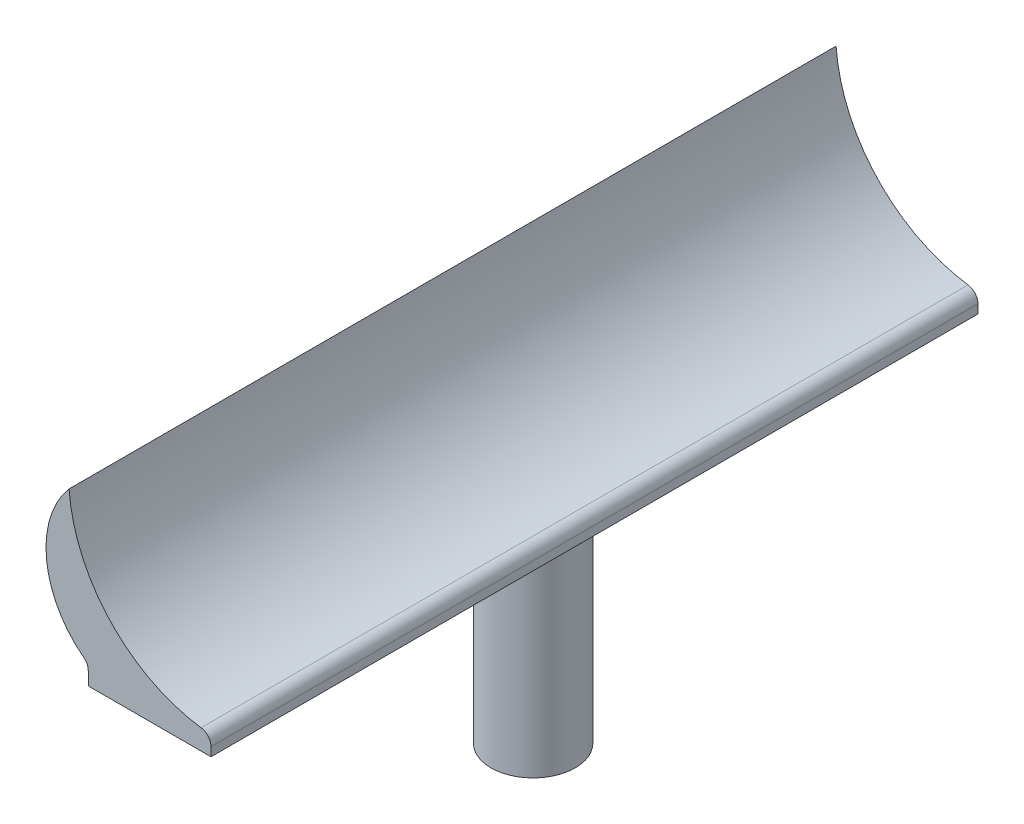
ISO-10303-21;
HEADER;
FILE_DESCRIPTION(('STEP AP214'),'2;1');
FILE_NAME('part.step','',(''),(''),'','','');
FILE_SCHEMA(('AUTOMOTIVE_DESIGN { 1 0 10303 214 1 1 1 1 }'));
ENDSEC;
DATA;
#1=APPLICATION_CONTEXT('core data for automotive mechanical design processes');
#2=APPLICATION_PROTOCOL_DEFINITION('international standard','automotive_design',2000,#1);
#3=PRODUCT_CONTEXT('',#1,'mechanical');
#4=PRODUCT('Part','Part','',(#3));
#5=PRODUCT_RELATED_PRODUCT_CATEGORY('part','',(#4));
#6=PRODUCT_DEFINITION_FORMATION('','',#4);
#7=PRODUCT_DEFINITION_CONTEXT('part definition',#1,'design');
#8=PRODUCT_DEFINITION('design','',#6,#7);
#9=PRODUCT_DEFINITION_SHAPE('','',#8);
#10=(LENGTH_UNIT() NAMED_UNIT(*) SI_UNIT(.MILLI.,.METRE.));
#11=(NAMED_UNIT(*) PLANE_ANGLE_UNIT() SI_UNIT($,.RADIAN.));
#12=(NAMED_UNIT(*) SI_UNIT($,.STERADIAN.) SOLID_ANGLE_UNIT());
#13=UNCERTAINTY_MEASURE_WITH_UNIT(LENGTH_MEASURE(1.E-05),#10,'distance_accuracy_value','');
#14=(GEOMETRIC_REPRESENTATION_CONTEXT(3) GLOBAL_UNCERTAINTY_ASSIGNED_CONTEXT((#13)) GLOBAL_UNIT_ASSIGNED_CONTEXT((#10,
#11,#12)) REPRESENTATION_CONTEXT('',''));
#15=CARTESIAN_POINT('',(0.,0.,0.));
#16=DIRECTION('',(0.,0.,1.));
#17=DIRECTION('',(1.,0.,0.));
#18=AXIS2_PLACEMENT_3D('',#15,#16,#17);
#19=CARTESIAN_POINT('',(0.,55.,0.));
#20=DIRECTION('',(0.,-1.,0.));
#21=DIRECTION('',(0.,0.,-1.));
#22=AXIS2_PLACEMENT_3D('',#19,#20,#21);
#23=CYLINDRICAL_SURFACE('',#22,11.);
#24=CARTESIAN_POINT('',(0.,55.,0.));
#25=DIRECTION('',(0.,1.,0.));
#26=DIRECTION('',(0.,0.,1.));
#27=AXIS2_PLACEMENT_3D('',#24,#25,#26);
#28=CIRCLE('',#27,11.);
#29=CARTESIAN_POINT('',(0.,55.,11.));
#30=VERTEX_POINT('',#29);
#31=EDGE_CURVE('E127',#30,#30,#28,.T.);
#32=ORIENTED_EDGE('',*,*,#31,.F.);
#33=EDGE_LOOP('',(#32));
#34=FACE_BOUND('',#33,.T.);
#35=CARTESIAN_POINT('',(0.,0.,0.));
#36=DIRECTION('',(0.,1.,0.));
#37=DIRECTION('',(0.,0.,1.));
#38=AXIS2_PLACEMENT_3D('',#35,#36,#37);
#39=CIRCLE('',#38,11.);
#40=CARTESIAN_POINT('',(0.,0.,11.));
#41=VERTEX_POINT('',#40);
#42=EDGE_CURVE('E125',#41,#41,#39,.T.);
#43=ORIENTED_EDGE('',*,*,#42,.T.);
#44=EDGE_LOOP('',(#43));
#45=FACE_BOUND('',#44,.T.);
#46=ADVANCED_FACE('F39',(#34,#45),#23,.T.);
#47=CARTESIAN_POINT('',(0.,0.,0.));
#48=DIRECTION('',(0.,1.,0.));
#49=DIRECTION('',(0.,0.,1.));
#50=AXIS2_PLACEMENT_3D('',#47,#48,#49);
#51=PLANE('',#50);
#52=ORIENTED_EDGE('',*,*,#42,.F.);
#53=EDGE_LOOP('',(#52));
#54=FACE_BOUND('',#53,.T.);
#55=ADVANCED_FACE('F167',(#54),#51,.F.);
#56=CARTESIAN_POINT('',(-16.,55.,100.));
#57=DIRECTION('',(1.,0.,0.));
#58=DIRECTION('',(0.,0.,-1.));
#59=AXIS2_PLACEMENT_3D('',#56,#57,#58);
#60=PLANE('',#59);
#61=DIRECTION('',(0.,-1.,0.));
#62=VECTOR('',#61,1.);
#63=CARTESIAN_POINT('',(-16.,55.,100.));
#64=LINE('',#63,#62);
#65=CARTESIAN_POINT('',(-16.,58.4618250900017,100.));
#66=VERTEX_POINT('',#65);
#67=CARTESIAN_POINT('',(-16.,55.,100.));
#68=VERTEX_POINT('',#67);
#69=EDGE_CURVE('E98',#66,#68,#64,.T.);
#70=ORIENTED_EDGE('',*,*,#69,.F.);
#71=DIRECTION('',(0.,0.,1.));
#72=VECTOR('',#71,1.);
#73=CARTESIAN_POINT('',(-16.,58.4618250900017,-100.));
#74=LINE('',#73,#72);
#75=CARTESIAN_POINT('',(-16.,58.4618250900017,-100.));
#76=VERTEX_POINT('',#75);
#77=EDGE_CURVE('E134',#66,#76,#74,.F.);
#78=ORIENTED_EDGE('',*,*,#77,.T.);
#79=DIRECTION('',(0.,-1.,0.));
#80=VECTOR('',#79,1.);
#81=CARTESIAN_POINT('',(-16.,55.,-100.));
#82=LINE('',#81,#80);
#83=CARTESIAN_POINT('',(-16.,55.,-100.));
#84=VERTEX_POINT('',#83);
#85=EDGE_CURVE('E124',#76,#84,#82,.T.);
#86=ORIENTED_EDGE('',*,*,#85,.T.);
#87=DIRECTION('',(0.,0.,-1.));
#88=VECTOR('',#87,1.);
#89=CARTESIAN_POINT('',(-16.,55.,100.));
#90=LINE('',#89,#88);
#91=EDGE_CURVE('E111',#68,#84,#90,.T.);
#92=ORIENTED_EDGE('',*,*,#91,.F.);
#93=EDGE_LOOP('',(#70,#78,#86,#92));
#94=FACE_BOUND('',#93,.T.);
#95=ADVANCED_FACE('F116',(#94),#60,.F.);
#96=CARTESIAN_POINT('',(-16.,55.,100.));
#97=DIRECTION('',(0.,1.,0.));
#98=DIRECTION('',(0.,0.,1.));
#99=AXIS2_PLACEMENT_3D('',#96,#97,#98);
#100=PLANE('',#99);
#101=ORIENTED_EDGE('',*,*,#31,.T.);
#102=EDGE_LOOP('',(#101));
#103=FACE_BOUND('',#102,.T.);
#104=DIRECTION('',(1.,0.,0.));
#105=VECTOR('',#104,1.);
#106=CARTESIAN_POINT('',(-16.,55.,-100.));
#107=LINE('',#106,#105);
#108=CARTESIAN_POINT('',(16.,55.,-100.));
#109=VERTEX_POINT('',#108);
#110=EDGE_CURVE('E263',#84,#109,#107,.T.);
#111=ORIENTED_EDGE('',*,*,#110,.T.);
#112=DIRECTION('',(0.,0.,-1.));
#113=VECTOR('',#112,1.);
#114=CARTESIAN_POINT('',(16.,55.,100.));
#115=LINE('',#114,#113);
#116=CARTESIAN_POINT('',(16.,55.,100.));
#117=VERTEX_POINT('',#116);
#118=EDGE_CURVE('E117',#117,#109,#115,.T.);
#119=ORIENTED_EDGE('',*,*,#118,.F.);
#120=DIRECTION('',(1.,0.,0.));
#121=VECTOR('',#120,1.);
#122=CARTESIAN_POINT('',(-16.,55.,100.));
#123=LINE('',#122,#121);
#124=EDGE_CURVE('E101',#68,#117,#123,.T.);
#125=ORIENTED_EDGE('',*,*,#124,.F.);
#126=ORIENTED_EDGE('',*,*,#91,.T.);
#127=EDGE_LOOP('',(#111,#119,#125,#126));
#128=FACE_BOUND('',#127,.T.);
#129=ADVANCED_FACE('F114',(#103,#128),#100,.F.);
#130=CARTESIAN_POINT('',(16.,55.,100.));
#131=DIRECTION('',(-1.,0.,0.));
#132=DIRECTION('',(0.,0.,1.));
#133=AXIS2_PLACEMENT_3D('',#130,#131,#132);
#134=PLANE('',#133);
#135=DIRECTION('',(0.,1.,0.));
#136=VECTOR('',#135,1.);
#137=CARTESIAN_POINT('',(16.,55.,-100.));
#138=LINE('',#137,#136);
#139=CARTESIAN_POINT('',(16.,57.3011041204456,-100.));
#140=VERTEX_POINT('',#139);
#141=EDGE_CURVE('E264',#109,#140,#138,.T.);
#142=ORIENTED_EDGE('',*,*,#141,.T.);
#143=DIRECTION('',(0.,0.,-1.));
#144=VECTOR('',#143,1.);
#145=CARTESIAN_POINT('',(16.,57.3011041204456,100.));
#146=LINE('',#145,#144);
#147=CARTESIAN_POINT('',(16.,57.3011041204456,100.));
#148=VERTEX_POINT('',#147);
#149=EDGE_CURVE('E53',#140,#148,#146,.F.);
#150=ORIENTED_EDGE('',*,*,#149,.T.);
#151=DIRECTION('',(0.,1.,0.));
#152=VECTOR('',#151,1.);
#153=CARTESIAN_POINT('',(16.,55.,100.));
#154=LINE('',#153,#152);
#155=EDGE_CURVE('E120',#117,#148,#154,.T.);
#156=ORIENTED_EDGE('',*,*,#155,.F.);
#157=ORIENTED_EDGE('',*,*,#118,.T.);
#158=EDGE_LOOP('',(#142,#150,#156,#157));
#159=FACE_BOUND('',#158,.T.);
#160=ADVANCED_FACE('F177',(#159),#134,.F.);
#161=CARTESIAN_POINT('',(18.8950928953347,99.8950928953347,100.));
#162=DIRECTION('',(0.,0.,-1.));
#163=DIRECTION('',(-1.,0.,0.));
#164=AXIS2_PLACEMENT_3D('',#161,#162,#163);
#165=CYLINDRICAL_SURFACE('',#164,40.);
#166=CARTESIAN_POINT('',(18.8950928953347,99.8950928953347,100.));
#167=DIRECTION('',(0.,0.,-1.));
#168=DIRECTION('',(1.,0.,0.));
#169=AXIS2_PLACEMENT_3D('',#166,#167,#168);
#170=CIRCLE('',#169,40.);
#171=CARTESIAN_POINT('',(13.4112855508373,60.272777755903,100.));
#172=VERTEX_POINT('',#171);
#173=CARTESIAN_POINT('',(-21.,97.,100.));
#174=VERTEX_POINT('',#173);
#175=EDGE_CURVE('E255',#172,#174,#170,.T.);
#176=ORIENTED_EDGE('',*,*,#175,.F.);
#177=DIRECTION('',(0.,0.,-1.));
#178=VECTOR('',#177,1.);
#179=CARTESIAN_POINT('',(13.4112855508373,60.272777755903,100.));
#180=LINE('',#179,#178);
#181=CARTESIAN_POINT('',(13.4112855508373,60.272777755903,-100.));
#182=VERTEX_POINT('',#181);
#183=EDGE_CURVE('E140',#172,#182,#180,.T.);
#184=ORIENTED_EDGE('',*,*,#183,.T.);
#185=CARTESIAN_POINT('',(18.8950928953347,99.8950928953347,-100.));
#186=DIRECTION('',(0.,0.,-1.));
#187=DIRECTION('',(1.,0.,0.));
#188=AXIS2_PLACEMENT_3D('',#185,#186,#187);
#189=CIRCLE('',#188,40.);
#190=CARTESIAN_POINT('',(-21.,97.,-100.));
#191=VERTEX_POINT('',#190);
#192=EDGE_CURVE('E152',#182,#191,#189,.T.);
#193=ORIENTED_EDGE('',*,*,#192,.T.);
#194=DIRECTION('',(0.,0.,-1.));
#195=VECTOR('',#194,1.);
#196=CARTESIAN_POINT('',(-21.,97.,100.));
#197=LINE('',#196,#195);
#198=EDGE_CURVE('E126',#174,#191,#197,.T.);
#199=ORIENTED_EDGE('',*,*,#198,.F.);
#200=EDGE_LOOP('',(#176,#184,#193,#199));
#201=FACE_BOUND('',#200,.T.);
#202=ADVANCED_FACE('F184',(#201),#165,.F.);
#203=CARTESIAN_POINT('',(-2.02149132334484,80.7268254968453,100.));
#204=DIRECTION('',(0.,0.,-1.));
#205=DIRECTION('',(-1.,0.,0.));
#206=AXIS2_PLACEMENT_3D('',#203,#204,#205);
#207=CYLINDRICAL_SURFACE('',#206,25.);
#208=CARTESIAN_POINT('',(-2.02149132334484,80.7268254968453,-100.));
#209=DIRECTION('',(0.,0.,1.));
#210=DIRECTION('',(-1.,0.,0.));
#211=AXIS2_PLACEMENT_3D('',#208,#209,#210);
#212=CIRCLE('',#211,25.);
#213=CARTESIAN_POINT('',(-17.1808740703584,60.8473608478778,-100.));
#214=VERTEX_POINT('',#213);
#215=EDGE_CURVE('E108',#191,#214,#212,.T.);
#216=ORIENTED_EDGE('',*,*,#215,.T.);
#217=DIRECTION('',(0.,0.,-1.));
#218=VECTOR('',#217,1.);
#219=CARTESIAN_POINT('',(-17.1808740703584,60.8473608478778,100.));
#220=LINE('',#219,#218);
#221=CARTESIAN_POINT('',(-17.1808740703584,60.8473608478778,100.));
#222=VERTEX_POINT('',#221);
#223=EDGE_CURVE('E139',#214,#222,#220,.F.);
#224=ORIENTED_EDGE('',*,*,#223,.T.);
#225=CARTESIAN_POINT('',(-2.02149132334484,80.7268254968453,100.));
#226=DIRECTION('',(0.,0.,1.));
#227=DIRECTION('',(-1.,0.,0.));
#228=AXIS2_PLACEMENT_3D('',#225,#226,#227);
#229=CIRCLE('',#228,25.);
#230=EDGE_CURVE('E258',#174,#222,#229,.T.);
#231=ORIENTED_EDGE('',*,*,#230,.F.);
#232=ORIENTED_EDGE('',*,*,#198,.T.);
#233=EDGE_LOOP('',(#216,#224,#231,#232));
#234=FACE_BOUND('',#233,.T.);
#235=ADVANCED_FACE('F151',(#234),#207,.T.);
#236=CARTESIAN_POINT('',(-2.02149132334484,80.7268254968453,100.));
#237=DIRECTION('',(0.,0.,-1.));
#238=DIRECTION('',(-1.,0.,0.));
#239=AXIS2_PLACEMENT_3D('',#236,#237,#238);
#240=PLANE('',#239);
#241=ORIENTED_EDGE('',*,*,#155,.T.);
#242=CARTESIAN_POINT('',(13.,57.3011041204456,100.));
#243=DIRECTION('',(0.,0.,-1.));
#244=DIRECTION('',(-1.,0.,0.));
#245=AXIS2_PLACEMENT_3D('',#242,#243,#244);
#246=CIRCLE('',#245,3.);
#247=EDGE_CURVE('E141',#148,#172,#246,.F.);
#248=ORIENTED_EDGE('',*,*,#247,.T.);
#249=ORIENTED_EDGE('',*,*,#175,.T.);
#250=ORIENTED_EDGE('',*,*,#230,.T.);
#251=CARTESIAN_POINT('',(-19.,58.4618250900017,100.));
#252=DIRECTION('',(0.,0.,-1.));
#253=DIRECTION('',(-1.,0.,0.));
#254=AXIS2_PLACEMENT_3D('',#251,#252,#253);
#255=CIRCLE('',#254,3.);
#256=EDGE_CURVE('E11',#222,#66,#255,.T.);
#257=ORIENTED_EDGE('',*,*,#256,.T.);
#258=ORIENTED_EDGE('',*,*,#69,.T.);
#259=ORIENTED_EDGE('',*,*,#124,.T.);
#260=EDGE_LOOP('',(#241,#248,#249,#250,#257,#258,#259));
#261=FACE_BOUND('',#260,.T.);
#262=ADVANCED_FACE('F99',(#261),#240,.F.);
#263=CARTESIAN_POINT('',(-2.02149132334484,80.7268254968453,-100.));
#264=DIRECTION('',(0.,0.,-1.));
#265=DIRECTION('',(-1.,0.,0.));
#266=AXIS2_PLACEMENT_3D('',#263,#264,#265);
#267=PLANE('',#266);
#268=ORIENTED_EDGE('',*,*,#192,.F.);
#269=CARTESIAN_POINT('',(13.,57.3011041204456,-100.));
#270=DIRECTION('',(0.,0.,-1.));
#271=DIRECTION('',(-1.,0.,0.));
#272=AXIS2_PLACEMENT_3D('',#269,#270,#271);
#273=CIRCLE('',#272,3.);
#274=EDGE_CURVE('E65',#182,#140,#273,.T.);
#275=ORIENTED_EDGE('',*,*,#274,.T.);
#276=ORIENTED_EDGE('',*,*,#141,.F.);
#277=ORIENTED_EDGE('',*,*,#110,.F.);
#278=ORIENTED_EDGE('',*,*,#85,.F.);
#279=CARTESIAN_POINT('',(-19.,58.4618250900017,-100.));
#280=DIRECTION('',(0.,0.,-1.));
#281=DIRECTION('',(-1.,0.,0.));
#282=AXIS2_PLACEMENT_3D('',#279,#280,#281);
#283=CIRCLE('',#282,3.);
#284=EDGE_CURVE('E50',#76,#214,#283,.F.);
#285=ORIENTED_EDGE('',*,*,#284,.T.);
#286=ORIENTED_EDGE('',*,*,#215,.F.);
#287=EDGE_LOOP('',(#268,#275,#276,#277,#278,#285,#286));
#288=FACE_BOUND('',#287,.T.);
#289=ADVANCED_FACE('F148',(#288),#267,.T.);
#290=CARTESIAN_POINT('',(-19.,58.4618250900017,100.));
#291=DIRECTION('',(0.,0.,-1.));
#292=DIRECTION('',(-1.,0.,0.));
#293=AXIS2_PLACEMENT_3D('',#290,#291,#292);
#294=CYLINDRICAL_SURFACE('',#293,3.);
#295=ORIENTED_EDGE('',*,*,#256,.F.);
#296=ORIENTED_EDGE('',*,*,#223,.F.);
#297=ORIENTED_EDGE('',*,*,#284,.F.);
#298=ORIENTED_EDGE('',*,*,#77,.F.);
#299=EDGE_LOOP('',(#295,#296,#297,#298));
#300=FACE_BOUND('',#299,.T.);
#301=ADVANCED_FACE('F156',(#300),#294,.F.);
#302=CARTESIAN_POINT('',(13.,57.3011041204456,100.));
#303=DIRECTION('',(0.,0.,-1.));
#304=DIRECTION('',(-1.,0.,0.));
#305=AXIS2_PLACEMENT_3D('',#302,#303,#304);
#306=CYLINDRICAL_SURFACE('',#305,3.);
#307=ORIENTED_EDGE('',*,*,#247,.F.);
#308=ORIENTED_EDGE('',*,*,#149,.F.);
#309=ORIENTED_EDGE('',*,*,#274,.F.);
#310=ORIENTED_EDGE('',*,*,#183,.F.);
#311=EDGE_LOOP('',(#307,#308,#309,#310));
#312=FACE_BOUND('',#311,.T.);
#313=ADVANCED_FACE('F41',(#312),#306,.T.);
#314=CLOSED_SHELL('',(#46,#55,#95,#129,#160,#202,#235,#262,#289,#301,#313));
#315=MANIFOLD_SOLID_BREP('B2',#314);
#316=ADVANCED_BREP_SHAPE_REPRESENTATION('',(#18,#315),#14);
#317=SHAPE_DEFINITION_REPRESENTATION(#9,#316);
ENDSEC;
END-ISO-10303-21;
